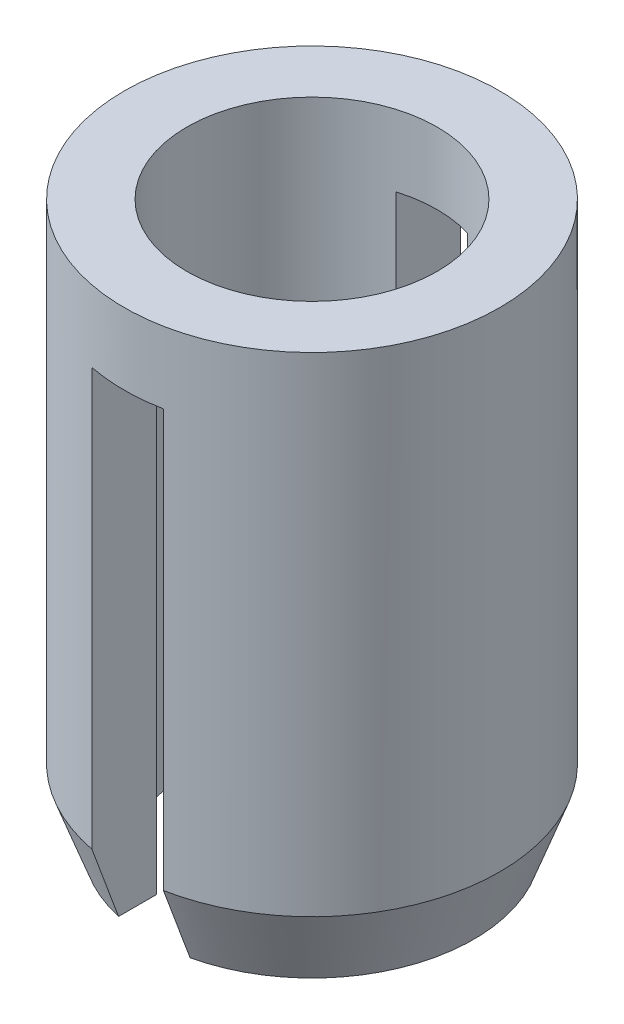
ISO-10303-21;
HEADER;
FILE_DESCRIPTION(('STEP AP214'),'2;1');
FILE_NAME('part.step','',(''),(''),'','','');
FILE_SCHEMA(('AUTOMOTIVE_DESIGN { 1 0 10303 214 1 1 1 1 }'));
ENDSEC;
DATA;
#1=APPLICATION_CONTEXT('core data for automotive mechanical design processes');
#2=APPLICATION_PROTOCOL_DEFINITION('international standard','automotive_design',2000,#1);
#3=PRODUCT_CONTEXT('',#1,'mechanical');
#4=PRODUCT('Part','Part','',(#3));
#5=PRODUCT_RELATED_PRODUCT_CATEGORY('part','',(#4));
#6=PRODUCT_DEFINITION_FORMATION('','',#4);
#7=PRODUCT_DEFINITION_CONTEXT('part definition',#1,'design');
#8=PRODUCT_DEFINITION('design','',#6,#7);
#9=PRODUCT_DEFINITION_SHAPE('','',#8);
#10=(LENGTH_UNIT() NAMED_UNIT(*) SI_UNIT(.MILLI.,.METRE.));
#11=(NAMED_UNIT(*) PLANE_ANGLE_UNIT() SI_UNIT($,.RADIAN.));
#12=(NAMED_UNIT(*) SI_UNIT($,.STERADIAN.) SOLID_ANGLE_UNIT());
#13=UNCERTAINTY_MEASURE_WITH_UNIT(LENGTH_MEASURE(1.E-05),#10,'distance_accuracy_value','');
#14=(GEOMETRIC_REPRESENTATION_CONTEXT(3) GLOBAL_UNCERTAINTY_ASSIGNED_CONTEXT((#13)) GLOBAL_UNIT_ASSIGNED_CONTEXT((#10,
#11,#12)) REPRESENTATION_CONTEXT('',''));
#15=CARTESIAN_POINT('',(0.,0.,0.));
#16=DIRECTION('',(0.,0.,1.));
#17=DIRECTION('',(1.,0.,0.));
#18=AXIS2_PLACEMENT_3D('',#15,#16,#17);
#19=CARTESIAN_POINT('',(-2.71323571888056,-9.4,0.));
#20=DIRECTION('',(0.,1.,0.));
#21=DIRECTION('',(-1.,0.,0.));
#22=AXIS2_PLACEMENT_3D('',#19,#20,#21);
#23=PLANE('',#22);
#24=CARTESIAN_POINT('',(0.,-9.4,0.));
#25=DIRECTION('',(0.,-1.,0.));
#26=DIRECTION('',(1.,0.,0.));
#27=AXIS2_PLACEMENT_3D('',#24,#25,#26);
#28=CIRCLE('',#27,2.71323571888056);
#29=CARTESIAN_POINT('',(0.599999999999999,-9.4,-2.64606274797278));
#30=VERTEX_POINT('',#29);
#31=CARTESIAN_POINT('',(0.599999999999999,-9.4,2.64606274797278));
#32=VERTEX_POINT('',#31);
#33=EDGE_CURVE('E202',#30,#32,#28,.T.);
#34=ORIENTED_EDGE('',*,*,#33,.T.);
#35=DIRECTION('',(0.,0.,1.));
#36=VECTOR('',#35,1.);
#37=CARTESIAN_POINT('',(0.599999999999999,-9.4,-3.15));
#38=LINE('',#37,#36);
#39=CARTESIAN_POINT('',(0.599999999999999,-9.4,2.01246117974981));
#40=VERTEX_POINT('',#39);
#41=EDGE_CURVE('E229',#40,#32,#38,.T.);
#42=ORIENTED_EDGE('',*,*,#41,.F.);
#43=CARTESIAN_POINT('',(0.,-9.4,0.));
#44=DIRECTION('',(0.,1.,0.));
#45=DIRECTION('',(0.,0.,1.));
#46=AXIS2_PLACEMENT_3D('',#43,#44,#45);
#47=CIRCLE('',#46,2.1);
#48=CARTESIAN_POINT('',(0.599999999999999,-9.4,-2.01246117974981));
#49=VERTEX_POINT('',#48);
#50=EDGE_CURVE('E199',#40,#49,#47,.T.);
#51=ORIENTED_EDGE('',*,*,#50,.T.);
#52=EDGE_CURVE('E146',#30,#49,#38,.T.);
#53=ORIENTED_EDGE('',*,*,#52,.F.);
#54=EDGE_LOOP('',(#34,#42,#51,#53));
#55=FACE_BOUND('',#54,.T.);
#56=ADVANCED_FACE('F34',(#55),#23,.F.);
#57=CARTESIAN_POINT('',(0.,-8.2,0.));
#58=DIRECTION('',(0.,1.,0.));
#59=DIRECTION('',(-1.,0.,0.));
#60=AXIS2_PLACEMENT_3D('',#57,#58,#59);
#61=CONICAL_SURFACE('',#60,3.15,0.349065850398867);
#62=ORIENTED_EDGE('',*,*,#33,.F.);
#63=CARTESIAN_POINT('',(0.599999999999998,-12.9645327882121,-1.2824338423444));
#64=CARTESIAN_POINT('',(0.599999999999998,-12.8013408592125,-1.34796510447624));
#65=CARTESIAN_POINT('',(0.599999999999998,-12.6378721564997,-1.41279956556584));
#66=CARTESIAN_POINT('',(0.599999999999998,-12.3105252468735,-1.54141961958765));
#67=CARTESIAN_POINT('',(0.599999999999999,-12.1466470465953,-1.60520522938901));
#68=CARTESIAN_POINT('',(0.599999999999999,-11.8186255218546,-1.7320722364563));
#69=CARTESIAN_POINT('',(0.599999999999999,-11.6544822066361,-1.79515365769397));
#70=CARTESIAN_POINT('',(0.599999999999999,-11.3259946693529,-1.92079331369806));
#71=CARTESIAN_POINT('',(0.599999999999999,-11.1616504463596,-1.98335154603563));
#72=CARTESIAN_POINT('',(0.599999999999999,-10.6593299131475,-2.17388671750886));
#73=CARTESIAN_POINT('',(0.599999999999999,-10.3211176745416,-2.30124125022278));
#74=CARTESIAN_POINT('',(0.599999999999999,-9.64432232998342,-2.55497794664405));
#75=CARTESIAN_POINT('',(0.599999999999999,-9.30573921730373,-2.68136009236745));
#76=CARTESIAN_POINT('',(0.599999999999999,-8.63289055083807,-2.93178723560662));
#77=CARTESIAN_POINT('',(0.599999999999999,-8.29862818546035,-3.05584080291351));
#78=CARTESIAN_POINT('',(0.599999999999999,-7.62994356657177,-3.30351635108532));
#79=CARTESIAN_POINT('',(0.599999999999999,-7.29552131300824,-3.42713833180797));
#80=CARTESIAN_POINT('',(0.599999999999999,-6.62657814221165,-3.67406613950676));
#81=CARTESIAN_POINT('',(0.599999999999999,-6.29205723040316,-3.79737198118281));
#82=CARTESIAN_POINT('',(0.599999999999999,-5.62292883147016,-4.04374741439309));
#83=CARTESIAN_POINT('',(0.599999999999999,-5.28832134444239,-4.16681700619004));
#84=CARTESIAN_POINT('',(0.599999999999999,-4.95368415904304,-4.28980562269296));
#85=B_SPLINE_CURVE_WITH_KNOTS('',3,(#63,#64,#65,#66,#67,#68,#69,#70,#71,#72,#73,#74,#75,#76,#77,
#78,#79,#80,#81,#82,#83,#84),.UNSPECIFIED.,.F.,.F.,(4,2,2,2,2,2,2,2,2,2,4),(0.,
0.527567680724832,1.05512686801875,1.58266804122414,2.11021166211797,3.19439513088764,
4.27859860330277,5.3482174923807,6.41783673404404,7.48740530399626,8.55697268385405),.UNSPECIFIED.);
#86=CARTESIAN_POINT('',(0.599999999999999,-8.2,-3.09232921921325));
#87=VERTEX_POINT('',#86);
#88=EDGE_CURVE('E187',#30,#87,#85,.T.);
#89=ORIENTED_EDGE('',*,*,#88,.T.);
#90=CARTESIAN_POINT('',(0.,-8.2,0.));
#91=DIRECTION('',(0.,-1.,0.));
#92=DIRECTION('',(1.,0.,0.));
#93=AXIS2_PLACEMENT_3D('',#90,#91,#92);
#94=CIRCLE('',#93,3.15);
#95=CARTESIAN_POINT('',(0.599999999999999,-8.2,3.09232921921325));
#96=VERTEX_POINT('',#95);
#97=EDGE_CURVE('E206',#87,#96,#94,.T.);
#98=ORIENTED_EDGE('',*,*,#97,.T.);
#99=CARTESIAN_POINT('',(0.599999999999999,-4.95368415904304,4.28980562269296));
#100=CARTESIAN_POINT('',(0.599999999999999,-5.28833492250036,4.16681201284318));
#101=CARTESIAN_POINT('',(0.599999999999999,-5.6229559865695,4.04373742502792));
#102=CARTESIAN_POINT('',(0.599999999999999,-6.2921099888553,3.79735254572654));
#103=CARTESIAN_POINT('',(0.599999999999999,-6.62664292737613,3.67404225506641));
#104=CARTESIAN_POINT('',(0.599999999999999,-7.29558459346547,3.42711494334559));
#105=CARTESIAN_POINT('',(0.599999999999999,-7.62999332435469,3.3034979312836));
#106=CARTESIAN_POINT('',(0.599999999999999,-8.29865234512945,3.05583184420202));
#107=CARTESIAN_POINT('',(0.599999999999999,-8.63290263438518,2.93178276748109));
#108=CARTESIAN_POINT('',(0.599999999999999,-9.30118537168483,2.68305495620415));
#109=CARTESIAN_POINT('',(0.599999999999999,-9.63521780970135,2.55837619469632));
#110=CARTESIAN_POINT('',(0.599999999999999,-10.3029265539808,2.30807600716046));
#111=CARTESIAN_POINT('',(0.599999999999999,-10.6366028634903,2.18245458981117));
#112=CARTESIAN_POINT('',(0.599999999999999,-11.1366794217646,1.99284625976465));
#113=CARTESIAN_POINT('',(0.599999999999999,-11.3033020115876,1.92944614624476));
#114=CARTESIAN_POINT('',(0.599999999999999,-11.6363433470334,1.80211489863359));
#115=CARTESIAN_POINT('',(0.599999999999999,-11.802762093607,1.73818376703042));
#116=CARTESIAN_POINT('',(0.599999999999999,-12.1353294912584,1.60960499895974));
#117=CARTESIAN_POINT('',(0.599999999999998,-12.3014781335609,1.54495733972666));
#118=CARTESIAN_POINT('',(0.599999999999998,-12.6333566978696,1.41458924214315));
#119=CARTESIAN_POINT('',(0.599999999999998,-12.7990866129809,1.34886878625906));
#120=CARTESIAN_POINT('',(0.599999999999998,-12.9645327882121,1.2824338423444));
#121=B_SPLINE_CURVE_WITH_KNOTS('',3,(#99,#100,#101,#102,#103,#104,#105,#106,#107,#108,#109,#110,
#111,#112,#113,#114,#115,#116,#117,#118,#119,#120),.UNSPECIFIED.,.F.,.F.,(4,2,2,2,2,2,2,2,2,2,
4),(0.,1.06961078110536,2.13921782075939,3.20879384244332,4.27837408056012,5.34800049360599,
6.41761707098081,6.95244713894219,7.48727470234246,8.02211930732011,8.55697266250882),.UNSPECIFIED.);
#122=EDGE_CURVE('E131',#96,#32,#121,.T.);
#123=ORIENTED_EDGE('',*,*,#122,.T.);
#124=EDGE_LOOP('',(#62,#89,#98,#123));
#125=FACE_BOUND('',#124,.T.);
#126=ADVANCED_FACE('F250',(#125),#61,.T.);
#127=CARTESIAN_POINT('',(-0.599999999999999,-9.4,2.64606274797279));
#128=VERTEX_POINT('',#127);
#129=CARTESIAN_POINT('',(-0.599999999999999,-9.4,-2.64606274797278));
#130=VERTEX_POINT('',#129);
#131=EDGE_CURVE('E205',#128,#130,#28,.T.);
#132=ORIENTED_EDGE('',*,*,#131,.T.);
#133=DIRECTION('',(0.,0.,1.));
#134=VECTOR('',#133,1.);
#135=CARTESIAN_POINT('',(-0.599999999999999,-9.4,-3.15));
#136=LINE('',#135,#134);
#137=CARTESIAN_POINT('',(-0.599999999999999,-9.4,-2.01246117974981));
#138=VERTEX_POINT('',#137);
#139=EDGE_CURVE('E139',#130,#138,#136,.T.);
#140=ORIENTED_EDGE('',*,*,#139,.T.);
#141=CARTESIAN_POINT('',(-0.599999999999999,-9.4,2.01246117974981));
#142=VERTEX_POINT('',#141);
#143=EDGE_CURVE('E198',#138,#142,#47,.T.);
#144=ORIENTED_EDGE('',*,*,#143,.T.);
#145=EDGE_CURVE('E136',#142,#128,#136,.T.);
#146=ORIENTED_EDGE('',*,*,#145,.T.);
#147=EDGE_LOOP('',(#132,#140,#144,#146));
#148=FACE_BOUND('',#147,.T.);
#149=ADVANCED_FACE('F36',(#148),#23,.F.);
#150=CARTESIAN_POINT('',(0.,0.,0.));
#151=DIRECTION('',(0.,-1.,0.));
#152=DIRECTION('',(1.,0.,0.));
#153=AXIS2_PLACEMENT_3D('',#150,#151,#152);
#154=PLANE('',#153);
#155=CARTESIAN_POINT('',(0.,0.,0.));
#156=DIRECTION('',(0.,1.,0.));
#157=DIRECTION('',(0.,0.,1.));
#158=AXIS2_PLACEMENT_3D('',#155,#156,#157);
#159=CIRCLE('',#158,2.1);
#160=CARTESIAN_POINT('',(0.,0.,2.1));
#161=VERTEX_POINT('',#160);
#162=EDGE_CURVE('E195',#161,#161,#159,.T.);
#163=ORIENTED_EDGE('',*,*,#162,.F.);
#164=EDGE_LOOP('',(#163));
#165=FACE_BOUND('',#164,.T.);
#166=CARTESIAN_POINT('',(0.,0.,0.));
#167=DIRECTION('',(0.,-1.,0.));
#168=DIRECTION('',(1.,0.,0.));
#169=AXIS2_PLACEMENT_3D('',#166,#167,#168);
#170=CIRCLE('',#169,3.15);
#171=CARTESIAN_POINT('',(3.15,0.,0.));
#172=VERTEX_POINT('',#171);
#173=EDGE_CURVE('E210',#172,#172,#170,.T.);
#174=ORIENTED_EDGE('',*,*,#173,.F.);
#175=EDGE_LOOP('',(#174));
#176=FACE_BOUND('',#175,.T.);
#177=ADVANCED_FACE('F256',(#165,#176),#154,.F.);
#178=CARTESIAN_POINT('',(0.,-9.4,0.));
#179=DIRECTION('',(0.,-1.,0.));
#180=DIRECTION('',(1.,0.,0.));
#181=AXIS2_PLACEMENT_3D('',#178,#179,#180);
#182=CYLINDRICAL_SURFACE('',#181,3.15);
#183=CARTESIAN_POINT('',(0.,-1.2,0.));
#184=DIRECTION('',(0.,1.,0.));
#185=DIRECTION('',(0.,0.,1.));
#186=AXIS2_PLACEMENT_3D('',#183,#184,#185);
#187=CIRCLE('',#186,3.15);
#188=CARTESIAN_POINT('',(-0.6,-1.2,3.09232921921325));
#189=VERTEX_POINT('',#188);
#190=CARTESIAN_POINT('',(0.6,-1.2,3.09232921921325));
#191=VERTEX_POINT('',#190);
#192=EDGE_CURVE('E122',#189,#191,#187,.T.);
#193=ORIENTED_EDGE('',*,*,#192,.T.);
#194=DIRECTION('',(0.,-1.,0.));
#195=VECTOR('',#194,1.);
#196=CARTESIAN_POINT('',(0.599999999999999,-9.4,3.09232921921325));
#197=LINE('',#196,#195);
#198=EDGE_CURVE('E179',#191,#96,#197,.T.);
#199=ORIENTED_EDGE('',*,*,#198,.T.);
#200=ORIENTED_EDGE('',*,*,#97,.F.);
#201=DIRECTION('',(0.,-1.,0.));
#202=VECTOR('',#201,1.);
#203=CARTESIAN_POINT('',(0.599999999999999,-9.4,-3.09232921921325));
#204=LINE('',#203,#202);
#205=CARTESIAN_POINT('',(0.6,-1.2,-3.09232921921325));
#206=VERTEX_POINT('',#205);
#207=EDGE_CURVE('E119',#87,#206,#204,.F.);
#208=ORIENTED_EDGE('',*,*,#207,.T.);
#209=CARTESIAN_POINT('',(-0.6,-1.2,-3.09232921921325));
#210=VERTEX_POINT('',#209);
#211=EDGE_CURVE('E111',#206,#210,#187,.T.);
#212=ORIENTED_EDGE('',*,*,#211,.T.);
#213=DIRECTION('',(0.,-1.,0.));
#214=VECTOR('',#213,1.);
#215=CARTESIAN_POINT('',(-0.599999999999999,-9.4,-3.09232921921325));
#216=LINE('',#215,#214);
#217=CARTESIAN_POINT('',(-0.599999999999999,-8.2,-3.09232921921325));
#218=VERTEX_POINT('',#217);
#219=EDGE_CURVE('E116',#210,#218,#216,.T.);
#220=ORIENTED_EDGE('',*,*,#219,.T.);
#221=CARTESIAN_POINT('',(-0.599999999999999,-8.2,3.09232921921325));
#222=VERTEX_POINT('',#221);
#223=EDGE_CURVE('E209',#222,#218,#94,.T.);
#224=ORIENTED_EDGE('',*,*,#223,.F.);
#225=DIRECTION('',(0.,-1.,0.));
#226=VECTOR('',#225,1.);
#227=CARTESIAN_POINT('',(-0.599999999999999,-9.4,3.09232921921325));
#228=LINE('',#227,#226);
#229=EDGE_CURVE('E155',#222,#189,#228,.F.);
#230=ORIENTED_EDGE('',*,*,#229,.T.);
#231=EDGE_LOOP('',(#193,#199,#200,#208,#212,#220,#224,#230));
#232=FACE_BOUND('',#231,.T.);
#233=ORIENTED_EDGE('',*,*,#173,.T.);
#234=EDGE_LOOP('',(#233));
#235=FACE_BOUND('',#234,.T.);
#236=ADVANCED_FACE('F113',(#232,#235),#182,.T.);
#237=ORIENTED_EDGE('',*,*,#223,.T.);
#238=CARTESIAN_POINT('',(-0.599999999999999,-4.95368415904304,-4.28980562269295));
#239=CARTESIAN_POINT('',(-0.599999999999999,-5.28833492250036,-4.16681201284318));
#240=CARTESIAN_POINT('',(-0.599999999999999,-5.6229559865695,-4.04373742502792));
#241=CARTESIAN_POINT('',(-0.599999999999999,-6.2921099888553,-3.79735254572654));
#242=CARTESIAN_POINT('',(-0.599999999999999,-6.62664292737613,-3.67404225506641));
#243=CARTESIAN_POINT('',(-0.599999999999999,-7.29558459346547,-3.42711494334559));
#244=CARTESIAN_POINT('',(-0.599999999999999,-7.62999332435469,-3.3034979312836));
#245=CARTESIAN_POINT('',(-0.599999999999999,-8.29865234512945,-3.05583184420202));
#246=CARTESIAN_POINT('',(-0.599999999999999,-8.63290263438518,-2.93178276748109));
#247=CARTESIAN_POINT('',(-0.599999999999999,-9.30118537168483,-2.68305495620415));
#248=CARTESIAN_POINT('',(-0.599999999999999,-9.63521780970135,-2.55837619469632));
#249=CARTESIAN_POINT('',(-0.599999999999999,-10.3029265539808,-2.30807600716046));
#250=CARTESIAN_POINT('',(-0.599999999999999,-10.6366028634903,-2.18245458981117));
#251=CARTESIAN_POINT('',(-0.599999999999999,-11.1366794217646,-1.99284625976465));
#252=CARTESIAN_POINT('',(-0.599999999999999,-11.3033020115877,-1.92944614624476));
#253=CARTESIAN_POINT('',(-0.599999999999999,-11.6363433470334,-1.80211489863359));
#254=CARTESIAN_POINT('',(-0.599999999999999,-11.802762093607,-1.73818376703042));
#255=CARTESIAN_POINT('',(-0.599999999999999,-12.1353294912584,-1.60960499895974));
#256=CARTESIAN_POINT('',(-0.599999999999998,-12.3014781335609,-1.54495733972666));
#257=CARTESIAN_POINT('',(-0.599999999999998,-12.6333566978696,-1.41458924214315));
#258=CARTESIAN_POINT('',(-0.599999999999998,-12.7990866129809,-1.34886878625906));
#259=CARTESIAN_POINT('',(-0.599999999999998,-12.9645327882121,-1.2824338423444));
#260=B_SPLINE_CURVE_WITH_KNOTS('',3,(#238,#239,#240,#241,#242,#243,#244,#245,#246,#247,#248,
#249,#250,#251,#252,#253,#254,#255,#256,#257,#258,#259),.UNSPECIFIED.,.F.,.F.,(4,2,2,2,2,2,2,2,
2,2,4),(0.,1.06961078110537,2.13921782075939,3.20879384244332,4.27837408056012,5.34800049360599,
6.41761707098081,6.9524471389422,7.48727470234246,8.02211930732011,8.55697266250882),.UNSPECIFIED.);
#261=EDGE_CURVE('E130',#218,#130,#260,.T.);
#262=ORIENTED_EDGE('',*,*,#261,.T.);
#263=ORIENTED_EDGE('',*,*,#131,.F.);
#264=CARTESIAN_POINT('',(-0.599999999999998,-12.9645327882121,1.2824338423444));
#265=CARTESIAN_POINT('',(-0.599999999999998,-12.8013408592126,1.34796510447624));
#266=CARTESIAN_POINT('',(-0.599999999999998,-12.6378721564997,1.41279956556584));
#267=CARTESIAN_POINT('',(-0.599999999999998,-12.3105252468735,1.54141961958765));
#268=CARTESIAN_POINT('',(-0.599999999999999,-12.1466470465953,1.60520522938901));
#269=CARTESIAN_POINT('',(-0.599999999999999,-11.8186255218546,1.7320722364563));
#270=CARTESIAN_POINT('',(-0.599999999999999,-11.6544822066361,1.79515365769397));
#271=CARTESIAN_POINT('',(-0.599999999999999,-11.3259946693529,1.92079331369806));
#272=CARTESIAN_POINT('',(-0.599999999999999,-11.1616504463596,1.98335154603563));
#273=CARTESIAN_POINT('',(-0.599999999999999,-10.6593299131475,2.17388671750886));
#274=CARTESIAN_POINT('',(-0.599999999999999,-10.3211176745416,2.30124125022277));
#275=CARTESIAN_POINT('',(-0.599999999999999,-9.64432232998342,2.55497794664405));
#276=CARTESIAN_POINT('',(-0.599999999999999,-9.30573921730373,2.68136009236744));
#277=CARTESIAN_POINT('',(-0.599999999999999,-8.63289055083807,2.93178723560662));
#278=CARTESIAN_POINT('',(-0.599999999999999,-8.29862818546035,3.05584080291351));
#279=CARTESIAN_POINT('',(-0.599999999999999,-7.62994356657177,3.30351635108532));
#280=CARTESIAN_POINT('',(-0.599999999999999,-7.29552131300824,3.42713833180797));
#281=CARTESIAN_POINT('',(-0.599999999999999,-6.62657814221164,3.67406613950676));
#282=CARTESIAN_POINT('',(-0.599999999999999,-6.29205723040316,3.79737198118281));
#283=CARTESIAN_POINT('',(-0.599999999999999,-5.62292883147016,4.04374741439309));
#284=CARTESIAN_POINT('',(-0.599999999999999,-5.28832134444239,4.16681700619004));
#285=CARTESIAN_POINT('',(-0.599999999999999,-4.95368415904304,4.28980562269295));
#286=B_SPLINE_CURVE_WITH_KNOTS('',3,(#264,#265,#266,#267,#268,#269,#270,#271,#272,#273,#274,
#275,#276,#277,#278,#279,#280,#281,#282,#283,#284,#285),.UNSPECIFIED.,.F.,.F.,(4,2,2,2,2,2,2,2,
2,2,4),(0.,0.527567680724833,1.05512686801875,1.58266804122414,2.11021166211798,
3.19439513088764,4.27859860330277,5.3482174923807,6.41783673404404,7.48740530399626,
8.55697268385405),.UNSPECIFIED.);
#287=EDGE_CURVE('E121',#128,#222,#286,.T.);
#288=ORIENTED_EDGE('',*,*,#287,.T.);
#289=EDGE_LOOP('',(#237,#262,#263,#288));
#290=FACE_BOUND('',#289,.T.);
#291=ADVANCED_FACE('F157',(#290),#61,.T.);
#292=CARTESIAN_POINT('',(0.,0.,0.));
#293=DIRECTION('',(0.,1.,0.));
#294=DIRECTION('',(0.,0.,1.));
#295=AXIS2_PLACEMENT_3D('',#292,#293,#294);
#296=CYLINDRICAL_SURFACE('',#295,2.1);
#297=CARTESIAN_POINT('',(0.,-1.2,0.));
#298=DIRECTION('',(0.,1.,0.));
#299=DIRECTION('',(0.,0.,1.));
#300=AXIS2_PLACEMENT_3D('',#297,#298,#299);
#301=CIRCLE('',#300,2.1);
#302=CARTESIAN_POINT('',(-0.6,-1.2,-2.01246117974981));
#303=VERTEX_POINT('',#302);
#304=CARTESIAN_POINT('',(0.6,-1.2,-2.01246117974981));
#305=VERTEX_POINT('',#304);
#306=EDGE_CURVE('E135',#303,#305,#301,.F.);
#307=ORIENTED_EDGE('',*,*,#306,.T.);
#308=DIRECTION('',(0.,1.,0.));
#309=VECTOR('',#308,1.);
#310=CARTESIAN_POINT('',(0.6,0.,-2.01246117974981));
#311=LINE('',#310,#309);
#312=EDGE_CURVE('E11',#305,#49,#311,.F.);
#313=ORIENTED_EDGE('',*,*,#312,.T.);
#314=ORIENTED_EDGE('',*,*,#50,.F.);
#315=DIRECTION('',(0.,1.,0.));
#316=VECTOR('',#315,1.);
#317=CARTESIAN_POINT('',(0.6,0.,2.01246117974981));
#318=LINE('',#317,#316);
#319=CARTESIAN_POINT('',(0.6,-1.2,2.01246117974981));
#320=VERTEX_POINT('',#319);
#321=EDGE_CURVE('E219',#40,#320,#318,.T.);
#322=ORIENTED_EDGE('',*,*,#321,.T.);
#323=CARTESIAN_POINT('',(-0.6,-1.2,2.01246117974981));
#324=VERTEX_POINT('',#323);
#325=EDGE_CURVE('E213',#320,#324,#301,.F.);
#326=ORIENTED_EDGE('',*,*,#325,.T.);
#327=DIRECTION('',(0.,1.,0.));
#328=VECTOR('',#327,1.);
#329=CARTESIAN_POINT('',(-0.6,0.,2.01246117974981));
#330=LINE('',#329,#328);
#331=EDGE_CURVE('E216',#324,#142,#330,.F.);
#332=ORIENTED_EDGE('',*,*,#331,.T.);
#333=ORIENTED_EDGE('',*,*,#143,.F.);
#334=DIRECTION('',(0.,1.,0.));
#335=VECTOR('',#334,1.);
#336=CARTESIAN_POINT('',(-0.6,0.,-2.01246117974981));
#337=LINE('',#336,#335);
#338=EDGE_CURVE('E42',#138,#303,#337,.T.);
#339=ORIENTED_EDGE('',*,*,#338,.T.);
#340=EDGE_LOOP('',(#307,#313,#314,#322,#326,#332,#333,#339));
#341=FACE_BOUND('',#340,.T.);
#342=ORIENTED_EDGE('',*,*,#162,.T.);
#343=EDGE_LOOP('',(#342));
#344=FACE_BOUND('',#343,.T.);
#345=ADVANCED_FACE('F185',(#341,#344),#296,.F.);
#346=CARTESIAN_POINT('',(0.6,-1.2,-3.15));
#347=DIRECTION('',(0.,1.,0.));
#348=DIRECTION('',(0.,0.,1.));
#349=AXIS2_PLACEMENT_3D('',#346,#347,#348);
#350=PLANE('',#349);
#351=ORIENTED_EDGE('',*,*,#192,.F.);
#352=DIRECTION('',(0.,0.,1.));
#353=VECTOR('',#352,1.);
#354=CARTESIAN_POINT('',(-0.6,-1.2,-3.15));
#355=LINE('',#354,#353);
#356=EDGE_CURVE('E57',#324,#189,#355,.T.);
#357=ORIENTED_EDGE('',*,*,#356,.F.);
#358=ORIENTED_EDGE('',*,*,#325,.F.);
#359=DIRECTION('',(0.,0.,1.));
#360=VECTOR('',#359,1.);
#361=CARTESIAN_POINT('',(0.6,-1.2,-3.15));
#362=LINE('',#361,#360);
#363=EDGE_CURVE('E143',#320,#191,#362,.T.);
#364=ORIENTED_EDGE('',*,*,#363,.T.);
#365=EDGE_LOOP('',(#351,#357,#358,#364));
#366=FACE_BOUND('',#365,.T.);
#367=ADVANCED_FACE('F242',(#366),#350,.F.);
#368=CARTESIAN_POINT('',(-0.6,-1.2,-3.15));
#369=DIRECTION('',(-1.,0.,0.));
#370=DIRECTION('',(0.,-1.,0.));
#371=AXIS2_PLACEMENT_3D('',#368,#369,#370);
#372=PLANE('',#371);
#373=ORIENTED_EDGE('',*,*,#287,.F.);
#374=ORIENTED_EDGE('',*,*,#145,.F.);
#375=ORIENTED_EDGE('',*,*,#331,.F.);
#376=ORIENTED_EDGE('',*,*,#356,.T.);
#377=ORIENTED_EDGE('',*,*,#229,.F.);
#378=EDGE_LOOP('',(#373,#374,#375,#376,#377));
#379=FACE_BOUND('',#378,.T.);
#380=ADVANCED_FACE('F165',(#379),#372,.F.);
#381=CARTESIAN_POINT('',(0.6,-1.2,-3.15));
#382=DIRECTION('',(1.,0.,0.));
#383=DIRECTION('',(0.,1.,0.));
#384=AXIS2_PLACEMENT_3D('',#381,#382,#383);
#385=PLANE('',#384);
#386=ORIENTED_EDGE('',*,*,#363,.F.);
#387=ORIENTED_EDGE('',*,*,#321,.F.);
#388=ORIENTED_EDGE('',*,*,#41,.T.);
#389=ORIENTED_EDGE('',*,*,#122,.F.);
#390=ORIENTED_EDGE('',*,*,#198,.F.);
#391=EDGE_LOOP('',(#386,#387,#388,#389,#390));
#392=FACE_BOUND('',#391,.T.);
#393=ADVANCED_FACE('F183',(#392),#385,.F.);
#394=ORIENTED_EDGE('',*,*,#88,.F.);
#395=ORIENTED_EDGE('',*,*,#52,.T.);
#396=ORIENTED_EDGE('',*,*,#312,.F.);
#397=EDGE_CURVE('E49',#206,#305,#362,.T.);
#398=ORIENTED_EDGE('',*,*,#397,.F.);
#399=ORIENTED_EDGE('',*,*,#207,.F.);
#400=EDGE_LOOP('',(#394,#395,#396,#398,#399));
#401=FACE_BOUND('',#400,.T.);
#402=ADVANCED_FACE('F164',(#401),#385,.F.);
#403=EDGE_CURVE('E127',#210,#303,#355,.T.);
#404=ORIENTED_EDGE('',*,*,#403,.T.);
#405=ORIENTED_EDGE('',*,*,#338,.F.);
#406=ORIENTED_EDGE('',*,*,#139,.F.);
#407=ORIENTED_EDGE('',*,*,#261,.F.);
#408=ORIENTED_EDGE('',*,*,#219,.F.);
#409=EDGE_LOOP('',(#404,#405,#406,#407,#408));
#410=FACE_BOUND('',#409,.T.);
#411=ADVANCED_FACE('F126',(#410),#372,.F.);
#412=ORIENTED_EDGE('',*,*,#397,.T.);
#413=ORIENTED_EDGE('',*,*,#306,.F.);
#414=ORIENTED_EDGE('',*,*,#403,.F.);
#415=ORIENTED_EDGE('',*,*,#211,.F.);
#416=EDGE_LOOP('',(#412,#413,#414,#415));
#417=FACE_BOUND('',#416,.T.);
#418=ADVANCED_FACE('F133',(#417),#350,.F.);
#419=CLOSED_SHELL('',(#56,#126,#149,#177,#236,#291,#345,#367,#380,#393,#402,#411,#418));
#420=MANIFOLD_SOLID_BREP('B2',#419);
#421=ADVANCED_BREP_SHAPE_REPRESENTATION('',(#18,#420),#14);
#422=SHAPE_DEFINITION_REPRESENTATION(#9,#421);
ENDSEC;
END-ISO-10303-21;
